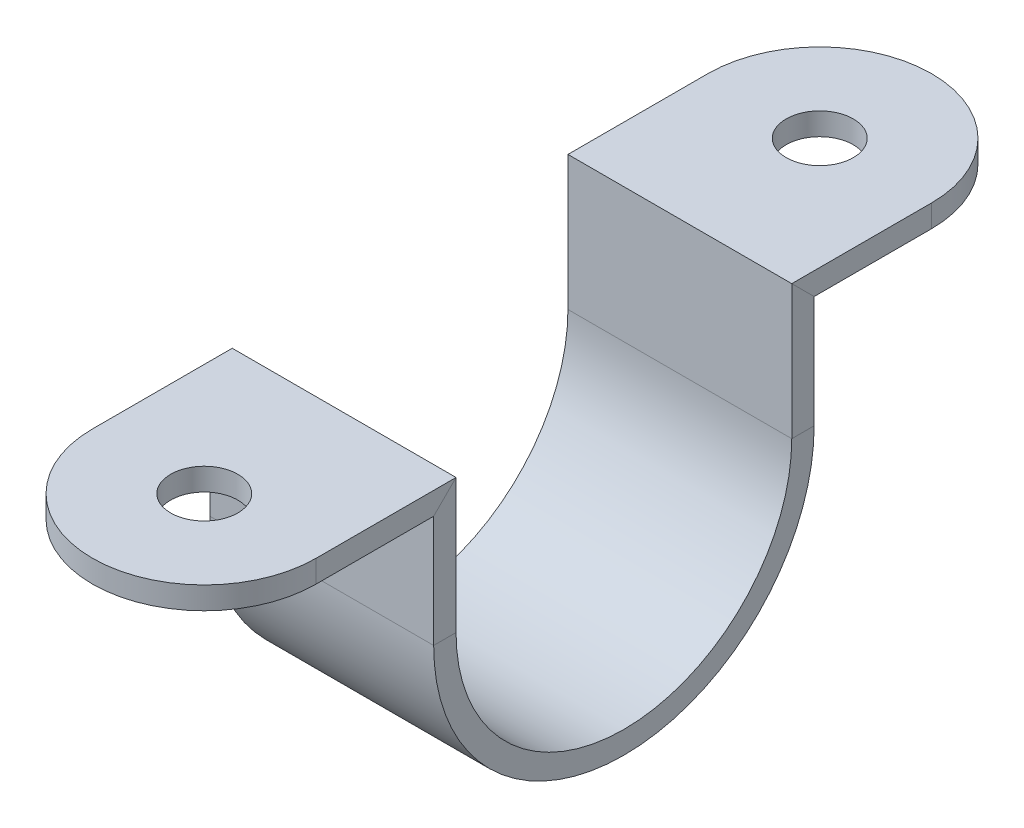
ISO-10303-21;
HEADER;
FILE_DESCRIPTION(('STEP AP214'),'2;1');
FILE_NAME('part.step','',(''),(''),'','','');
FILE_SCHEMA(('AUTOMOTIVE_DESIGN { 1 0 10303 214 1 1 1 1 }'));
ENDSEC;
DATA;
#1=APPLICATION_CONTEXT('core data for automotive mechanical design processes');
#2=APPLICATION_PROTOCOL_DEFINITION('international standard','automotive_design',2000,#1);
#3=PRODUCT_CONTEXT('',#1,'mechanical');
#4=PRODUCT('Part','Part','',(#3));
#5=PRODUCT_RELATED_PRODUCT_CATEGORY('part','',(#4));
#6=PRODUCT_DEFINITION_FORMATION('','',#4);
#7=PRODUCT_DEFINITION_CONTEXT('part definition',#1,'design');
#8=PRODUCT_DEFINITION('design','',#6,#7);
#9=PRODUCT_DEFINITION_SHAPE('','',#8);
#10=(LENGTH_UNIT() NAMED_UNIT(*) SI_UNIT(.MILLI.,.METRE.));
#11=(NAMED_UNIT(*) PLANE_ANGLE_UNIT() SI_UNIT($,.RADIAN.));
#12=(NAMED_UNIT(*) SI_UNIT($,.STERADIAN.) SOLID_ANGLE_UNIT());
#13=UNCERTAINTY_MEASURE_WITH_UNIT(LENGTH_MEASURE(1.E-05),#10,'distance_accuracy_value','');
#14=(GEOMETRIC_REPRESENTATION_CONTEXT(3) GLOBAL_UNCERTAINTY_ASSIGNED_CONTEXT((#13)) GLOBAL_UNIT_ASSIGNED_CONTEXT((#10,
#11,#12)) REPRESENTATION_CONTEXT('',''));
#15=CARTESIAN_POINT('',(0.,0.,0.));
#16=DIRECTION('',(0.,0.,1.));
#17=DIRECTION('',(1.,0.,0.));
#18=AXIS2_PLACEMENT_3D('',#15,#16,#17);
#19=CARTESIAN_POINT('',(0.,0.,-32.5));
#20=DIRECTION('',(0.,-1.,0.));
#21=DIRECTION('',(0.,0.,-1.));
#22=AXIS2_PLACEMENT_3D('',#19,#20,#21);
#23=CYLINDRICAL_SURFACE('',#22,5.);
#24=DIRECTION('',(0.,-1.,0.));
#25=VECTOR('',#24,1.);
#26=CARTESIAN_POINT('',(-5.,0.,-32.5));
#27=LINE('',#26,#25);
#28=CARTESIAN_POINT('',(-5.,0.,-32.5));
#29=VERTEX_POINT('',#28);
#30=CARTESIAN_POINT('',(-5.,-1.,-32.5));
#31=VERTEX_POINT('',#30);
#32=EDGE_CURVE('E254',#29,#31,#27,.T.);
#33=ORIENTED_EDGE('',*,*,#32,.F.);
#34=CARTESIAN_POINT('',(0.,0.,-32.5));
#35=DIRECTION('',(0.,-1.,0.));
#36=DIRECTION('',(0.,0.,-1.));
#37=AXIS2_PLACEMENT_3D('',#34,#35,#36);
#38=CIRCLE('',#37,5.);
#39=CARTESIAN_POINT('',(5.,0.,-32.5));
#40=VERTEX_POINT('',#39);
#41=EDGE_CURVE('E45',#40,#29,#38,.F.);
#42=ORIENTED_EDGE('',*,*,#41,.F.);
#43=DIRECTION('',(0.,-1.,0.));
#44=VECTOR('',#43,1.);
#45=CARTESIAN_POINT('',(5.,0.,-32.5));
#46=LINE('',#45,#44);
#47=CARTESIAN_POINT('',(5.,-1.,-32.5));
#48=VERTEX_POINT('',#47);
#49=EDGE_CURVE('E257',#48,#40,#46,.F.);
#50=ORIENTED_EDGE('',*,*,#49,.F.);
#51=CARTESIAN_POINT('',(0.,-1.,-32.5));
#52=DIRECTION('',(0.,1.,0.));
#53=DIRECTION('',(0.,0.,1.));
#54=AXIS2_PLACEMENT_3D('',#51,#52,#53);
#55=CIRCLE('',#54,5.);
#56=EDGE_CURVE('E11',#31,#48,#55,.F.);
#57=ORIENTED_EDGE('',*,*,#56,.F.);
#58=EDGE_LOOP('',(#33,#42,#50,#57));
#59=FACE_BOUND('',#58,.T.);
#60=ADVANCED_FACE('F36',(#59),#23,.T.);
#61=CARTESIAN_POINT('',(0.,0.,-5.));
#62=DIRECTION('',(0.,1.,0.));
#63=DIRECTION('',(0.,0.,1.));
#64=AXIS2_PLACEMENT_3D('',#61,#62,#63);
#65=CYLINDRICAL_SURFACE('',#64,5.);
#66=DIRECTION('',(0.,-1.,0.));
#67=VECTOR('',#66,1.);
#68=CARTESIAN_POINT('',(5.,0.,-5.));
#69=LINE('',#68,#67);
#70=CARTESIAN_POINT('',(5.,0.,-5.));
#71=VERTEX_POINT('',#70);
#72=CARTESIAN_POINT('',(5.,-1.,-5.));
#73=VERTEX_POINT('',#72);
#74=EDGE_CURVE('E170',#71,#73,#69,.T.);
#75=ORIENTED_EDGE('',*,*,#74,.F.);
#76=CARTESIAN_POINT('',(0.,0.,-5.));
#77=DIRECTION('',(0.,-1.,0.));
#78=DIRECTION('',(0.,0.,-1.));
#79=AXIS2_PLACEMENT_3D('',#76,#77,#78);
#80=CIRCLE('',#79,5.);
#81=CARTESIAN_POINT('',(-5.,0.,-5.));
#82=VERTEX_POINT('',#81);
#83=EDGE_CURVE('E132',#82,#71,#80,.F.);
#84=ORIENTED_EDGE('',*,*,#83,.F.);
#85=DIRECTION('',(0.,-1.,0.));
#86=VECTOR('',#85,1.);
#87=CARTESIAN_POINT('',(-5.,0.,-5.));
#88=LINE('',#87,#86);
#89=CARTESIAN_POINT('',(-5.,-1.,-5.));
#90=VERTEX_POINT('',#89);
#91=EDGE_CURVE('E248',#90,#82,#88,.F.);
#92=ORIENTED_EDGE('',*,*,#91,.F.);
#93=CARTESIAN_POINT('',(0.,-1.,-5.));
#94=DIRECTION('',(0.,1.,0.));
#95=DIRECTION('',(0.,0.,1.));
#96=AXIS2_PLACEMENT_3D('',#93,#94,#95);
#97=CIRCLE('',#96,5.);
#98=EDGE_CURVE('E252',#73,#90,#97,.F.);
#99=ORIENTED_EDGE('',*,*,#98,.F.);
#100=EDGE_LOOP('',(#75,#84,#92,#99));
#101=FACE_BOUND('',#100,.T.);
#102=ADVANCED_FACE('F287',(#101),#65,.T.);
#103=CARTESIAN_POINT('',(-5.,0.,-26.25));
#104=DIRECTION('',(1.,0.,0.));
#105=DIRECTION('',(0.,0.,-1.));
#106=AXIS2_PLACEMENT_3D('',#103,#104,#105);
#107=PLANE('',#106);
#108=DIRECTION('',(0.,0.,-1.));
#109=VECTOR('',#108,1.);
#110=CARTESIAN_POINT('',(-5.,0.,-26.25));
#111=LINE('',#110,#109);
#112=CARTESIAN_POINT('',(-5.,0.,-26.25));
#113=VERTEX_POINT('',#112);
#114=EDGE_CURVE('E228',#113,#29,#111,.T.);
#115=ORIENTED_EDGE('',*,*,#114,.T.);
#116=ORIENTED_EDGE('',*,*,#32,.T.);
#117=DIRECTION('',(0.,0.,-1.));
#118=VECTOR('',#117,1.);
#119=CARTESIAN_POINT('',(-5.,-1.,-26.25));
#120=LINE('',#119,#118);
#121=CARTESIAN_POINT('',(-5.,-1.,-27.25));
#122=VERTEX_POINT('',#121);
#123=EDGE_CURVE('E243',#122,#31,#120,.T.);
#124=ORIENTED_EDGE('',*,*,#123,.F.);
#125=DIRECTION('',(0.,0.707106781186548,0.707106781186548));
#126=VECTOR('',#125,1.);
#127=CARTESIAN_POINT('',(-5.,-3.,-29.25));
#128=LINE('',#127,#126);
#129=EDGE_CURVE('E186',#122,#113,#128,.T.);
#130=ORIENTED_EDGE('',*,*,#129,.T.);
#131=EDGE_LOOP('',(#115,#116,#124,#130));
#132=FACE_BOUND('',#131,.T.);
#133=ADVANCED_FACE('F285',(#132),#107,.F.);
#134=CARTESIAN_POINT('',(-5.,-1.,-26.25));
#135=DIRECTION('',(0.,1.,0.));
#136=DIRECTION('',(0.,0.,1.));
#137=AXIS2_PLACEMENT_3D('',#134,#135,#136);
#138=PLANE('',#137);
#139=CARTESIAN_POINT('',(0.,-1.,-32.5));
#140=DIRECTION('',(0.,1.,0.));
#141=DIRECTION('',(0.,0.,1.));
#142=AXIS2_PLACEMENT_3D('',#139,#140,#141);
#143=CIRCLE('',#142,1.5);
#144=CARTESIAN_POINT('',(0.,-1.,-31.));
#145=VERTEX_POINT('',#144);
#146=EDGE_CURVE('E166',#145,#145,#143,.T.);
#147=ORIENTED_EDGE('',*,*,#146,.T.);
#148=EDGE_LOOP('',(#147));
#149=FACE_BOUND('',#148,.T.);
#150=ORIENTED_EDGE('',*,*,#123,.T.);
#151=ORIENTED_EDGE('',*,*,#56,.T.);
#152=DIRECTION('',(0.,0.,-1.));
#153=VECTOR('',#152,1.);
#154=CARTESIAN_POINT('',(5.,-1.,-26.25));
#155=LINE('',#154,#153);
#156=CARTESIAN_POINT('',(5.,-1.,-27.25));
#157=VERTEX_POINT('',#156);
#158=EDGE_CURVE('E240',#157,#48,#155,.T.);
#159=ORIENTED_EDGE('',*,*,#158,.F.);
#160=DIRECTION('',(-1.,0.,0.));
#161=VECTOR('',#160,1.);
#162=CARTESIAN_POINT('',(-5.,-1.,-27.25));
#163=LINE('',#162,#161);
#164=EDGE_CURVE('E227',#157,#122,#163,.T.);
#165=ORIENTED_EDGE('',*,*,#164,.T.);
#166=EDGE_LOOP('',(#150,#151,#159,#165));
#167=FACE_BOUND('',#166,.T.);
#168=ADVANCED_FACE('F273',(#149,#167),#138,.F.);
#169=CARTESIAN_POINT('',(5.,0.,-26.25));
#170=DIRECTION('',(-1.,0.,0.));
#171=DIRECTION('',(0.,0.,1.));
#172=AXIS2_PLACEMENT_3D('',#169,#170,#171);
#173=PLANE('',#172);
#174=ORIENTED_EDGE('',*,*,#158,.T.);
#175=ORIENTED_EDGE('',*,*,#49,.T.);
#176=DIRECTION('',(0.,0.,-1.));
#177=VECTOR('',#176,1.);
#178=CARTESIAN_POINT('',(5.,0.,-26.25));
#179=LINE('',#178,#177);
#180=CARTESIAN_POINT('',(5.,0.,-26.25));
#181=VERTEX_POINT('',#180);
#182=EDGE_CURVE('E237',#181,#40,#179,.T.);
#183=ORIENTED_EDGE('',*,*,#182,.F.);
#184=DIRECTION('',(0.,-0.707106781186548,-0.707106781186548));
#185=VECTOR('',#184,1.);
#186=CARTESIAN_POINT('',(5.,-3.,-29.25));
#187=LINE('',#186,#185);
#188=EDGE_CURVE('E224',#181,#157,#187,.T.);
#189=ORIENTED_EDGE('',*,*,#188,.T.);
#190=EDGE_LOOP('',(#174,#175,#183,#189));
#191=FACE_BOUND('',#190,.T.);
#192=ADVANCED_FACE('F300',(#191),#173,.F.);
#193=CARTESIAN_POINT('',(-5.,0.,-26.25));
#194=DIRECTION('',(0.,-1.,0.));
#195=DIRECTION('',(0.,0.,-1.));
#196=AXIS2_PLACEMENT_3D('',#193,#194,#195);
#197=PLANE('',#196);
#198=CARTESIAN_POINT('',(0.,0.,-32.5));
#199=DIRECTION('',(0.,-1.,0.));
#200=DIRECTION('',(0.,0.,-1.));
#201=AXIS2_PLACEMENT_3D('',#198,#199,#200);
#202=CIRCLE('',#201,1.5);
#203=CARTESIAN_POINT('',(0.,0.,-31.));
#204=VERTEX_POINT('',#203);
#205=EDGE_CURVE('E40',#204,#204,#202,.T.);
#206=ORIENTED_EDGE('',*,*,#205,.T.);
#207=EDGE_LOOP('',(#206));
#208=FACE_BOUND('',#207,.T.);
#209=ORIENTED_EDGE('',*,*,#182,.T.);
#210=ORIENTED_EDGE('',*,*,#41,.T.);
#211=ORIENTED_EDGE('',*,*,#114,.F.);
#212=DIRECTION('',(-1.,0.,0.));
#213=VECTOR('',#212,1.);
#214=CARTESIAN_POINT('',(-5.,0.,-26.25));
#215=LINE('',#214,#213);
#216=EDGE_CURVE('E146',#181,#113,#215,.T.);
#217=ORIENTED_EDGE('',*,*,#216,.F.);
#218=EDGE_LOOP('',(#209,#210,#211,#217));
#219=FACE_BOUND('',#218,.T.);
#220=ADVANCED_FACE('F297',(#208,#219),#197,.F.);
#221=CARTESIAN_POINT('',(-5.,0.,-11.25));
#222=DIRECTION('',(1.,0.,0.));
#223=DIRECTION('',(0.,0.,-1.));
#224=AXIS2_PLACEMENT_3D('',#221,#222,#223);
#225=PLANE('',#224);
#226=DIRECTION('',(0.,0.707106781186548,-0.707106781186548));
#227=VECTOR('',#226,1.);
#228=CARTESIAN_POINT('',(-5.,-5.625,-5.625));
#229=LINE('',#228,#227);
#230=CARTESIAN_POINT('',(-5.,-0.999999999999998,-10.25));
#231=VERTEX_POINT('',#230);
#232=CARTESIAN_POINT('',(-5.,0.,-11.25));
#233=VERTEX_POINT('',#232);
#234=EDGE_CURVE('E162',#231,#233,#229,.T.);
#235=ORIENTED_EDGE('',*,*,#234,.T.);
#236=DIRECTION('',(0.,-1.,0.));
#237=VECTOR('',#236,1.);
#238=CARTESIAN_POINT('',(-5.,0.,-11.25));
#239=LINE('',#238,#237);
#240=CARTESIAN_POINT('',(-5.,-6.,-11.25));
#241=VERTEX_POINT('',#240);
#242=EDGE_CURVE('E160',#233,#241,#239,.T.);
#243=ORIENTED_EDGE('',*,*,#242,.T.);
#244=DIRECTION('',(0.,0.,1.));
#245=VECTOR('',#244,1.);
#246=CARTESIAN_POINT('',(-5.,-6.,-11.25));
#247=LINE('',#246,#245);
#248=CARTESIAN_POINT('',(-5.,-6.,-10.25));
#249=VERTEX_POINT('',#248);
#250=EDGE_CURVE('E180',#241,#249,#247,.T.);
#251=ORIENTED_EDGE('',*,*,#250,.T.);
#252=DIRECTION('',(0.,-1.,0.));
#253=VECTOR('',#252,1.);
#254=CARTESIAN_POINT('',(-5.,0.,-10.25));
#255=LINE('',#254,#253);
#256=EDGE_CURVE('E177',#231,#249,#255,.T.);
#257=ORIENTED_EDGE('',*,*,#256,.F.);
#258=EDGE_LOOP('',(#235,#243,#251,#257));
#259=FACE_BOUND('',#258,.T.);
#260=ADVANCED_FACE('F332',(#259),#225,.F.);
#261=CARTESIAN_POINT('',(-5.,0.,-10.25));
#262=DIRECTION('',(0.,0.,-1.));
#263=DIRECTION('',(-1.,0.,0.));
#264=AXIS2_PLACEMENT_3D('',#261,#262,#263);
#265=PLANE('',#264);
#266=DIRECTION('',(-1.,0.,0.));
#267=VECTOR('',#266,1.);
#268=CARTESIAN_POINT('',(-5.,-1.,-10.25));
#269=LINE('',#268,#267);
#270=CARTESIAN_POINT('',(5.,-1.,-10.25));
#271=VERTEX_POINT('',#270);
#272=EDGE_CURVE('E145',#271,#231,#269,.T.);
#273=ORIENTED_EDGE('',*,*,#272,.T.);
#274=ORIENTED_EDGE('',*,*,#256,.T.);
#275=DIRECTION('',(1.,0.,0.));
#276=VECTOR('',#275,1.);
#277=CARTESIAN_POINT('',(-5.,-6.,-10.25));
#278=LINE('',#277,#276);
#279=CARTESIAN_POINT('',(5.,-6.,-10.25));
#280=VERTEX_POINT('',#279);
#281=EDGE_CURVE('E179',#249,#280,#278,.T.);
#282=ORIENTED_EDGE('',*,*,#281,.T.);
#283=DIRECTION('',(0.,-1.,0.));
#284=VECTOR('',#283,1.);
#285=CARTESIAN_POINT('',(5.,0.,-10.25));
#286=LINE('',#285,#284);
#287=EDGE_CURVE('E181',#271,#280,#286,.T.);
#288=ORIENTED_EDGE('',*,*,#287,.F.);
#289=EDGE_LOOP('',(#273,#274,#282,#288));
#290=FACE_BOUND('',#289,.T.);
#291=ADVANCED_FACE('F359',(#290),#265,.F.);
#292=CARTESIAN_POINT('',(5.,0.,-11.25));
#293=DIRECTION('',(-1.,0.,0.));
#294=DIRECTION('',(0.,0.,1.));
#295=AXIS2_PLACEMENT_3D('',#292,#293,#294);
#296=PLANE('',#295);
#297=DIRECTION('',(0.,-0.707106781186548,0.707106781186548));
#298=VECTOR('',#297,1.);
#299=CARTESIAN_POINT('',(5.,-5.625,-5.625));
#300=LINE('',#299,#298);
#301=CARTESIAN_POINT('',(5.,0.,-11.25));
#302=VERTEX_POINT('',#301);
#303=EDGE_CURVE('E139',#302,#271,#300,.T.);
#304=ORIENTED_EDGE('',*,*,#303,.T.);
#305=ORIENTED_EDGE('',*,*,#287,.T.);
#306=DIRECTION('',(0.,0.,-1.));
#307=VECTOR('',#306,1.);
#308=CARTESIAN_POINT('',(5.,-6.,-11.25));
#309=LINE('',#308,#307);
#310=CARTESIAN_POINT('',(5.,-6.,-11.25));
#311=VERTEX_POINT('',#310);
#312=EDGE_CURVE('E153',#280,#311,#309,.T.);
#313=ORIENTED_EDGE('',*,*,#312,.T.);
#314=DIRECTION('',(0.,-1.,0.));
#315=VECTOR('',#314,1.);
#316=CARTESIAN_POINT('',(5.,0.,-11.25));
#317=LINE('',#316,#315);
#318=EDGE_CURVE('E150',#302,#311,#317,.T.);
#319=ORIENTED_EDGE('',*,*,#318,.F.);
#320=EDGE_LOOP('',(#304,#305,#313,#319));
#321=FACE_BOUND('',#320,.T.);
#322=ADVANCED_FACE('F151',(#321),#296,.F.);
#323=CARTESIAN_POINT('',(-5.,0.,-11.25));
#324=DIRECTION('',(0.,0.,1.));
#325=DIRECTION('',(1.,0.,0.));
#326=AXIS2_PLACEMENT_3D('',#323,#324,#325);
#327=PLANE('',#326);
#328=DIRECTION('',(-1.,0.,0.));
#329=VECTOR('',#328,1.);
#330=CARTESIAN_POINT('',(-5.,-6.,-11.25));
#331=LINE('',#330,#329);
#332=EDGE_CURVE('E156',#311,#241,#331,.T.);
#333=ORIENTED_EDGE('',*,*,#332,.T.);
#334=ORIENTED_EDGE('',*,*,#242,.F.);
#335=DIRECTION('',(-1.,0.,0.));
#336=VECTOR('',#335,1.);
#337=CARTESIAN_POINT('',(-5.,0.,-11.25));
#338=LINE('',#337,#336);
#339=EDGE_CURVE('E130',#302,#233,#338,.T.);
#340=ORIENTED_EDGE('',*,*,#339,.F.);
#341=ORIENTED_EDGE('',*,*,#318,.T.);
#342=EDGE_LOOP('',(#333,#334,#340,#341));
#343=FACE_BOUND('',#342,.T.);
#344=ADVANCED_FACE('F158',(#343),#327,.F.);
#345=CARTESIAN_POINT('',(-5.,-6.,-11.25));
#346=DIRECTION('',(1.,0.,0.));
#347=DIRECTION('',(0.,0.,-1.));
#348=AXIS2_PLACEMENT_3D('',#345,#346,#347);
#349=PLANE('',#348);
#350=CARTESIAN_POINT('',(-5.,-6.,-18.75));
#351=DIRECTION('',(1.,0.,0.));
#352=DIRECTION('',(0.,0.,1.));
#353=AXIS2_PLACEMENT_3D('',#350,#351,#352);
#354=CIRCLE('',#353,8.5);
#355=CARTESIAN_POINT('',(-5.,-6.00000000000001,-27.25));
#356=VERTEX_POINT('',#355);
#357=EDGE_CURVE('E190',#249,#356,#354,.T.);
#358=ORIENTED_EDGE('',*,*,#357,.F.);
#359=ORIENTED_EDGE('',*,*,#250,.F.);
#360=CARTESIAN_POINT('',(-5.,-6.,-18.75));
#361=DIRECTION('',(1.,0.,0.));
#362=DIRECTION('',(0.,0.,1.));
#363=AXIS2_PLACEMENT_3D('',#360,#361,#362);
#364=CIRCLE('',#363,7.5);
#365=CARTESIAN_POINT('',(-5.,-6.00000000000001,-26.25));
#366=VERTEX_POINT('',#365);
#367=EDGE_CURVE('E191',#241,#366,#364,.T.);
#368=ORIENTED_EDGE('',*,*,#367,.T.);
#369=DIRECTION('',(0.,0.,-1.));
#370=VECTOR('',#369,1.);
#371=CARTESIAN_POINT('',(-5.,-6.,-26.25));
#372=LINE('',#371,#370);
#373=EDGE_CURVE('E187',#366,#356,#372,.T.);
#374=ORIENTED_EDGE('',*,*,#373,.T.);
#375=EDGE_LOOP('',(#358,#359,#368,#374));
#376=FACE_BOUND('',#375,.T.);
#377=ADVANCED_FACE('F380',(#376),#349,.F.);
#378=CARTESIAN_POINT('',(0.,-6.,-18.75));
#379=DIRECTION('',(1.,0.,0.));
#380=DIRECTION('',(0.,0.,-1.));
#381=AXIS2_PLACEMENT_3D('',#378,#379,#380);
#382=CYLINDRICAL_SURFACE('',#381,8.5);
#383=CARTESIAN_POINT('',(5.,-6.,-18.75));
#384=DIRECTION('',(1.,0.,0.));
#385=DIRECTION('',(0.,0.,1.));
#386=AXIS2_PLACEMENT_3D('',#383,#384,#385);
#387=CIRCLE('',#386,8.5);
#388=CARTESIAN_POINT('',(5.,-6.00000000000001,-27.25));
#389=VERTEX_POINT('',#388);
#390=EDGE_CURVE('E206',#280,#389,#387,.T.);
#391=ORIENTED_EDGE('',*,*,#390,.F.);
#392=ORIENTED_EDGE('',*,*,#281,.F.);
#393=ORIENTED_EDGE('',*,*,#357,.T.);
#394=DIRECTION('',(1.,0.,0.));
#395=VECTOR('',#394,1.);
#396=CARTESIAN_POINT('',(-5.,-6.,-27.25));
#397=LINE('',#396,#395);
#398=EDGE_CURVE('E194',#356,#389,#397,.T.);
#399=ORIENTED_EDGE('',*,*,#398,.T.);
#400=EDGE_LOOP('',(#391,#392,#393,#399));
#401=FACE_BOUND('',#400,.T.);
#402=ADVANCED_FACE('F387',(#401),#382,.T.);
#403=CARTESIAN_POINT('',(5.,-6.,-11.25));
#404=DIRECTION('',(-1.,0.,0.));
#405=DIRECTION('',(0.,0.,1.));
#406=AXIS2_PLACEMENT_3D('',#403,#404,#405);
#407=PLANE('',#406);
#408=CARTESIAN_POINT('',(5.,-6.,-18.75));
#409=DIRECTION('',(1.,0.,0.));
#410=DIRECTION('',(0.,0.,1.));
#411=AXIS2_PLACEMENT_3D('',#408,#409,#410);
#412=CIRCLE('',#411,7.5);
#413=CARTESIAN_POINT('',(5.,-6.00000000000001,-26.25));
#414=VERTEX_POINT('',#413);
#415=EDGE_CURVE('E213',#311,#414,#412,.T.);
#416=ORIENTED_EDGE('',*,*,#415,.F.);
#417=ORIENTED_EDGE('',*,*,#312,.F.);
#418=ORIENTED_EDGE('',*,*,#390,.T.);
#419=DIRECTION('',(0.,0.,1.));
#420=VECTOR('',#419,1.);
#421=CARTESIAN_POINT('',(5.,-6.,-26.25));
#422=LINE('',#421,#420);
#423=EDGE_CURVE('E209',#389,#414,#422,.T.);
#424=ORIENTED_EDGE('',*,*,#423,.T.);
#425=EDGE_LOOP('',(#416,#417,#418,#424));
#426=FACE_BOUND('',#425,.T.);
#427=ADVANCED_FACE('F315',(#426),#407,.F.);
#428=CARTESIAN_POINT('',(0.,-6.,-18.75));
#429=DIRECTION('',(1.,0.,0.));
#430=DIRECTION('',(0.,0.,-1.));
#431=AXIS2_PLACEMENT_3D('',#428,#429,#430);
#432=CYLINDRICAL_SURFACE('',#431,7.5);
#433=DIRECTION('',(-1.,0.,0.));
#434=VECTOR('',#433,1.);
#435=CARTESIAN_POINT('',(-5.,-6.,-26.25));
#436=LINE('',#435,#434);
#437=EDGE_CURVE('E201',#414,#366,#436,.T.);
#438=ORIENTED_EDGE('',*,*,#437,.T.);
#439=ORIENTED_EDGE('',*,*,#367,.F.);
#440=ORIENTED_EDGE('',*,*,#332,.F.);
#441=ORIENTED_EDGE('',*,*,#415,.T.);
#442=EDGE_LOOP('',(#438,#439,#440,#441));
#443=FACE_BOUND('',#442,.T.);
#444=ADVANCED_FACE('F311',(#443),#432,.F.);
#445=CARTESIAN_POINT('',(-5.,-6.,-26.25));
#446=DIRECTION('',(0.,0.,-1.));
#447=DIRECTION('',(-1.,0.,0.));
#448=AXIS2_PLACEMENT_3D('',#445,#446,#447);
#449=PLANE('',#448);
#450=ORIENTED_EDGE('',*,*,#216,.T.);
#451=DIRECTION('',(0.,1.,0.));
#452=VECTOR('',#451,1.);
#453=CARTESIAN_POINT('',(-5.,-6.,-26.25));
#454=LINE('',#453,#452);
#455=EDGE_CURVE('E197',#366,#113,#454,.T.);
#456=ORIENTED_EDGE('',*,*,#455,.F.);
#457=ORIENTED_EDGE('',*,*,#437,.F.);
#458=DIRECTION('',(0.,1.,0.));
#459=VECTOR('',#458,1.);
#460=CARTESIAN_POINT('',(5.,-6.,-26.25));
#461=LINE('',#460,#459);
#462=EDGE_CURVE('E216',#414,#181,#461,.T.);
#463=ORIENTED_EDGE('',*,*,#462,.T.);
#464=EDGE_LOOP('',(#450,#456,#457,#463));
#465=FACE_BOUND('',#464,.T.);
#466=ADVANCED_FACE('F309',(#465),#449,.F.);
#467=CARTESIAN_POINT('',(-5.,-6.,-26.25));
#468=DIRECTION('',(1.,0.,0.));
#469=DIRECTION('',(0.,0.,-1.));
#470=AXIS2_PLACEMENT_3D('',#467,#468,#469);
#471=PLANE('',#470);
#472=DIRECTION('',(0.,1.,0.));
#473=VECTOR('',#472,1.);
#474=CARTESIAN_POINT('',(-5.,-6.,-27.25));
#475=LINE('',#474,#473);
#476=EDGE_CURVE('E200',#356,#122,#475,.T.);
#477=ORIENTED_EDGE('',*,*,#476,.F.);
#478=ORIENTED_EDGE('',*,*,#373,.F.);
#479=ORIENTED_EDGE('',*,*,#455,.T.);
#480=ORIENTED_EDGE('',*,*,#129,.F.);
#481=EDGE_LOOP('',(#477,#478,#479,#480));
#482=FACE_BOUND('',#481,.T.);
#483=ADVANCED_FACE('F306',(#482),#471,.F.);
#484=CARTESIAN_POINT('',(-5.,-6.,-27.25));
#485=DIRECTION('',(0.,0.,1.));
#486=DIRECTION('',(1.,0.,0.));
#487=AXIS2_PLACEMENT_3D('',#484,#485,#486);
#488=PLANE('',#487);
#489=DIRECTION('',(0.,1.,0.));
#490=VECTOR('',#489,1.);
#491=CARTESIAN_POINT('',(5.,-6.,-27.25));
#492=LINE('',#491,#490);
#493=EDGE_CURVE('E219',#389,#157,#492,.T.);
#494=ORIENTED_EDGE('',*,*,#493,.F.);
#495=ORIENTED_EDGE('',*,*,#398,.F.);
#496=ORIENTED_EDGE('',*,*,#476,.T.);
#497=ORIENTED_EDGE('',*,*,#164,.F.);
#498=EDGE_LOOP('',(#494,#495,#496,#497));
#499=FACE_BOUND('',#498,.T.);
#500=ADVANCED_FACE('F303',(#499),#488,.F.);
#501=CARTESIAN_POINT('',(5.,-6.,-26.25));
#502=DIRECTION('',(-1.,0.,0.));
#503=DIRECTION('',(0.,0.,1.));
#504=AXIS2_PLACEMENT_3D('',#501,#502,#503);
#505=PLANE('',#504);
#506=ORIENTED_EDGE('',*,*,#462,.F.);
#507=ORIENTED_EDGE('',*,*,#423,.F.);
#508=ORIENTED_EDGE('',*,*,#493,.T.);
#509=ORIENTED_EDGE('',*,*,#188,.F.);
#510=EDGE_LOOP('',(#506,#507,#508,#509));
#511=FACE_BOUND('',#510,.T.);
#512=ADVANCED_FACE('F318',(#511),#505,.F.);
#513=CARTESIAN_POINT('',(-5.,0.,0.));
#514=DIRECTION('',(0.,-1.,0.));
#515=DIRECTION('',(0.,0.,-1.));
#516=AXIS2_PLACEMENT_3D('',#513,#514,#515);
#517=PLANE('',#516);
#518=CARTESIAN_POINT('',(0.,0.,-5.));
#519=DIRECTION('',(0.,-1.,0.));
#520=DIRECTION('',(0.,0.,-1.));
#521=AXIS2_PLACEMENT_3D('',#518,#519,#520);
#522=CIRCLE('',#521,1.5);
#523=CARTESIAN_POINT('',(0.,0.,-3.5));
#524=VERTEX_POINT('',#523);
#525=EDGE_CURVE('E261',#524,#524,#522,.T.);
#526=ORIENTED_EDGE('',*,*,#525,.T.);
#527=EDGE_LOOP('',(#526));
#528=FACE_BOUND('',#527,.T.);
#529=DIRECTION('',(0.,0.,-1.));
#530=VECTOR('',#529,1.);
#531=CARTESIAN_POINT('',(-5.,0.,0.));
#532=LINE('',#531,#530);
#533=EDGE_CURVE('E169',#82,#233,#532,.T.);
#534=ORIENTED_EDGE('',*,*,#533,.F.);
#535=ORIENTED_EDGE('',*,*,#83,.T.);
#536=DIRECTION('',(0.,0.,-1.));
#537=VECTOR('',#536,1.);
#538=CARTESIAN_POINT('',(5.,0.,0.));
#539=LINE('',#538,#537);
#540=EDGE_CURVE('E125',#71,#302,#539,.T.);
#541=ORIENTED_EDGE('',*,*,#540,.T.);
#542=ORIENTED_EDGE('',*,*,#339,.T.);
#543=EDGE_LOOP('',(#534,#535,#541,#542));
#544=FACE_BOUND('',#543,.T.);
#545=ADVANCED_FACE('F128',(#528,#544),#517,.F.);
#546=CARTESIAN_POINT('',(-5.,0.,0.));
#547=DIRECTION('',(1.,0.,0.));
#548=DIRECTION('',(0.,0.,-1.));
#549=AXIS2_PLACEMENT_3D('',#546,#547,#548);
#550=PLANE('',#549);
#551=DIRECTION('',(0.,0.,-1.));
#552=VECTOR('',#551,1.);
#553=CARTESIAN_POINT('',(-5.,-1.,0.));
#554=LINE('',#553,#552);
#555=EDGE_CURVE('E171',#90,#231,#554,.T.);
#556=ORIENTED_EDGE('',*,*,#555,.F.);
#557=ORIENTED_EDGE('',*,*,#91,.T.);
#558=ORIENTED_EDGE('',*,*,#533,.T.);
#559=ORIENTED_EDGE('',*,*,#234,.F.);
#560=EDGE_LOOP('',(#556,#557,#558,#559));
#561=FACE_BOUND('',#560,.T.);
#562=ADVANCED_FACE('F325',(#561),#550,.F.);
#563=CARTESIAN_POINT('',(-5.,-1.,0.));
#564=DIRECTION('',(0.,1.,0.));
#565=DIRECTION('',(0.,0.,1.));
#566=AXIS2_PLACEMENT_3D('',#563,#564,#565);
#567=PLANE('',#566);
#568=CARTESIAN_POINT('',(0.,-0.999999999999999,-5.));
#569=DIRECTION('',(0.,1.,0.));
#570=DIRECTION('',(0.,0.,1.));
#571=AXIS2_PLACEMENT_3D('',#568,#569,#570);
#572=CIRCLE('',#571,1.5);
#573=CARTESIAN_POINT('',(0.,-1.,-3.5));
#574=VERTEX_POINT('',#573);
#575=EDGE_CURVE('E259',#574,#574,#572,.T.);
#576=ORIENTED_EDGE('',*,*,#575,.T.);
#577=EDGE_LOOP('',(#576));
#578=FACE_BOUND('',#577,.T.);
#579=DIRECTION('',(0.,0.,-1.));
#580=VECTOR('',#579,1.);
#581=CARTESIAN_POINT('',(5.,-1.,0.));
#582=LINE('',#581,#580);
#583=EDGE_CURVE('E136',#73,#271,#582,.T.);
#584=ORIENTED_EDGE('',*,*,#583,.F.);
#585=ORIENTED_EDGE('',*,*,#98,.T.);
#586=ORIENTED_EDGE('',*,*,#555,.T.);
#587=ORIENTED_EDGE('',*,*,#272,.F.);
#588=EDGE_LOOP('',(#584,#585,#586,#587));
#589=FACE_BOUND('',#588,.T.);
#590=ADVANCED_FACE('F445',(#578,#589),#567,.F.);
#591=CARTESIAN_POINT('',(5.,0.,0.));
#592=DIRECTION('',(-1.,0.,0.));
#593=DIRECTION('',(0.,0.,1.));
#594=AXIS2_PLACEMENT_3D('',#591,#592,#593);
#595=PLANE('',#594);
#596=ORIENTED_EDGE('',*,*,#540,.F.);
#597=ORIENTED_EDGE('',*,*,#74,.T.);
#598=ORIENTED_EDGE('',*,*,#583,.T.);
#599=ORIENTED_EDGE('',*,*,#303,.F.);
#600=EDGE_LOOP('',(#596,#597,#598,#599));
#601=FACE_BOUND('',#600,.T.);
#602=ADVANCED_FACE('F141',(#601),#595,.F.);
#603=CARTESIAN_POINT('',(0.,-14.5,-5.));
#604=DIRECTION('',(0.,1.,0.));
#605=DIRECTION('',(0.,0.,1.));
#606=AXIS2_PLACEMENT_3D('',#603,#604,#605);
#607=CYLINDRICAL_SURFACE('',#606,1.5);
#608=CARTESIAN_POINT('',(0.,-1.,-3.5));
#609=CARTESIAN_POINT('',(0.,-0.989583333333334,-3.5));
#610=CARTESIAN_POINT('',(0.,-0.979166666666668,-3.5));
#611=CARTESIAN_POINT('',(0.,-0.958333333333334,-3.5));
#612=CARTESIAN_POINT('',(0.,-0.947916666666668,-3.5));
#613=CARTESIAN_POINT('',(0.,-0.927083333333334,-3.5));
#614=CARTESIAN_POINT('',(0.,-0.916666666666668,-3.5));
#615=CARTESIAN_POINT('',(0.,-0.895833333333334,-3.5));
#616=CARTESIAN_POINT('',(0.,-0.885416666666668,-3.5));
#617=CARTESIAN_POINT('',(0.,-0.864583333333334,-3.5));
#618=CARTESIAN_POINT('',(0.,-0.854166666666667,-3.5));
#619=CARTESIAN_POINT('',(0.,-0.833333333333334,-3.5));
#620=CARTESIAN_POINT('',(0.,-0.822916666666667,-3.5));
#621=CARTESIAN_POINT('',(0.,-0.802083333333334,-3.5));
#622=CARTESIAN_POINT('',(0.,-0.791666666666667,-3.5));
#623=CARTESIAN_POINT('',(0.,-0.770833333333334,-3.5));
#624=CARTESIAN_POINT('',(0.,-0.760416666666667,-3.5));
#625=CARTESIAN_POINT('',(0.,-0.739583333333334,-3.5));
#626=CARTESIAN_POINT('',(0.,-0.729166666666667,-3.5));
#627=CARTESIAN_POINT('',(0.,-0.708333333333334,-3.5));
#628=CARTESIAN_POINT('',(0.,-0.697916666666667,-3.5));
#629=CARTESIAN_POINT('',(0.,-0.677083333333334,-3.5));
#630=CARTESIAN_POINT('',(0.,-0.666666666666667,-3.5));
#631=CARTESIAN_POINT('',(0.,-0.645833333333334,-3.5));
#632=CARTESIAN_POINT('',(0.,-0.635416666666667,-3.5));
#633=CARTESIAN_POINT('',(0.,-0.614583333333334,-3.5));
#634=CARTESIAN_POINT('',(0.,-0.604166666666667,-3.5));
#635=CARTESIAN_POINT('',(0.,-0.583333333333334,-3.5));
#636=CARTESIAN_POINT('',(0.,-0.572916666666667,-3.5));
#637=CARTESIAN_POINT('',(0.,-0.552083333333334,-3.5));
#638=CARTESIAN_POINT('',(0.,-0.541666666666667,-3.5));
#639=CARTESIAN_POINT('',(0.,-0.520833333333334,-3.5));
#640=CARTESIAN_POINT('',(0.,-0.510416666666667,-3.5));
#641=CARTESIAN_POINT('',(0.,-0.489583333333334,-3.5));
#642=CARTESIAN_POINT('',(0.,-0.479166666666667,-3.5));
#643=CARTESIAN_POINT('',(0.,-0.458333333333334,-3.5));
#644=CARTESIAN_POINT('',(0.,-0.447916666666667,-3.5));
#645=CARTESIAN_POINT('',(0.,-0.427083333333334,-3.5));
#646=CARTESIAN_POINT('',(0.,-0.416666666666667,-3.5));
#647=CARTESIAN_POINT('',(0.,-0.395833333333334,-3.5));
#648=CARTESIAN_POINT('',(0.,-0.385416666666667,-3.5));
#649=CARTESIAN_POINT('',(0.,-0.364583333333334,-3.5));
#650=CARTESIAN_POINT('',(0.,-0.354166666666667,-3.5));
#651=CARTESIAN_POINT('',(0.,-0.333333333333334,-3.5));
#652=CARTESIAN_POINT('',(0.,-0.322916666666667,-3.5));
#653=CARTESIAN_POINT('',(0.,-0.302083333333334,-3.5));
#654=CARTESIAN_POINT('',(0.,-0.291666666666667,-3.5));
#655=CARTESIAN_POINT('',(0.,-0.270833333333334,-3.5));
#656=CARTESIAN_POINT('',(0.,-0.260416666666667,-3.5));
#657=CARTESIAN_POINT('',(0.,-0.239583333333334,-3.5));
#658=CARTESIAN_POINT('',(0.,-0.229166666666667,-3.5));
#659=CARTESIAN_POINT('',(0.,-0.208333333333334,-3.5));
#660=CARTESIAN_POINT('',(0.,-0.197916666666667,-3.5));
#661=CARTESIAN_POINT('',(0.,-0.177083333333333,-3.5));
#662=CARTESIAN_POINT('',(0.,-0.166666666666667,-3.5));
#663=CARTESIAN_POINT('',(0.,-0.145833333333333,-3.5));
#664=CARTESIAN_POINT('',(0.,-0.135416666666667,-3.5));
#665=CARTESIAN_POINT('',(0.,-0.114583333333333,-3.5));
#666=CARTESIAN_POINT('',(0.,-0.104166666666667,-3.5));
#667=CARTESIAN_POINT('',(0.,-0.0833333333333334,-3.5));
#668=CARTESIAN_POINT('',(0.,-0.0729166666666667,-3.5));
#669=CARTESIAN_POINT('',(0.,-0.0520833333333334,-3.5));
#670=CARTESIAN_POINT('',(0.,-0.0416666666666667,-3.5));
#671=CARTESIAN_POINT('',(0.,-0.0208333333333333,-3.5));
#672=CARTESIAN_POINT('',(0.,-0.0104166666666667,-3.5));
#673=CARTESIAN_POINT('',(0.,0.,-3.5));
#674=B_SPLINE_CURVE_WITH_KNOTS('',3,(#608,#609,#610,#611,#612,#613,#614,#615,#616,#617,#618,
#619,#620,#621,#622,#623,#624,#625,#626,#627,#628,#629,#630,#631,#632,#633,#634,#635,#636,#637,
#638,#639,#640,#641,#642,#643,#644,#645,#646,#647,#648,#649,#650,#651,#652,#653,#654,#655,#656,
#657,#658,#659,#660,#661,#662,#663,#664,#665,#666,#667,#668,#669,#670,#671,#672,#673),
.UNSPECIFIED.,.F.,.F.,(4,2,2,2,2,2,2,2,2,2,2,2,2,2,2,2,2,2,2,2,2,2,2,2,2,2,2,2,2,2,2,2,4),(0.,
0.03125,0.0625000000000001,0.0937500000000001,0.125,0.15625,0.1875,0.21875,0.25,0.28125,0.3125,
0.34375,0.375,0.40625,0.4375,0.46875,0.5,0.53125,0.5625,0.593750000000001,0.625000000000001,
0.656250000000001,0.687500000000001,0.718750000000001,0.750000000000001,0.781250000000001,
0.812500000000001,0.843750000000001,0.875000000000001,0.906250000000001,0.937500000000001,
0.968750000000001,1.),.UNSPECIFIED.);
#675=EDGE_CURVE('BSEAM277',#574,#524,#674,.T.);
#676=ORIENTED_EDGE('',*,*,#575,.F.);
#677=ORIENTED_EDGE('',*,*,#525,.F.);
#678=ORIENTED_EDGE('',*,*,#675,.T.);
#679=ORIENTED_EDGE('',*,*,#675,.F.);
#680=EDGE_LOOP('',(#676,#678,#677,#679));
#681=FACE_BOUND('',#680,.T.);
#682=ADVANCED_FACE('F277',(#681),#607,.F.);
#683=CARTESIAN_POINT('',(0.,-14.5,-32.5));
#684=DIRECTION('',(0.,1.,0.));
#685=DIRECTION('',(0.,0.,1.));
#686=AXIS2_PLACEMENT_3D('',#683,#684,#685);
#687=CYLINDRICAL_SURFACE('',#686,1.5);
#688=CARTESIAN_POINT('',(0.,0.,-31.));
#689=CARTESIAN_POINT('',(0.,-0.0104166666666701,-31.));
#690=CARTESIAN_POINT('',(0.,-0.0208333333333368,-31.));
#691=CARTESIAN_POINT('',(0.,-0.0416666666666702,-31.));
#692=CARTESIAN_POINT('',(0.,-0.0520833333333369,-31.));
#693=CARTESIAN_POINT('',(0.,-0.0729166666666702,-31.));
#694=CARTESIAN_POINT('',(0.,-0.0833333333333369,-31.));
#695=CARTESIAN_POINT('',(0.,-0.10416666666667,-31.));
#696=CARTESIAN_POINT('',(0.,-0.114583333333337,-31.));
#697=CARTESIAN_POINT('',(0.,-0.13541666666667,-31.));
#698=CARTESIAN_POINT('',(0.,-0.145833333333337,-31.));
#699=CARTESIAN_POINT('',(0.,-0.16666666666667,-31.));
#700=CARTESIAN_POINT('',(0.,-0.177083333333337,-31.));
#701=CARTESIAN_POINT('',(0.,-0.19791666666667,-31.));
#702=CARTESIAN_POINT('',(0.,-0.208333333333337,-31.));
#703=CARTESIAN_POINT('',(0.,-0.22916666666667,-31.));
#704=CARTESIAN_POINT('',(0.,-0.239583333333337,-31.));
#705=CARTESIAN_POINT('',(0.,-0.26041666666667,-31.));
#706=CARTESIAN_POINT('',(0.,-0.270833333333337,-31.));
#707=CARTESIAN_POINT('',(0.,-0.29166666666667,-31.));
#708=CARTESIAN_POINT('',(0.,-0.302083333333337,-31.));
#709=CARTESIAN_POINT('',(0.,-0.32291666666667,-31.));
#710=CARTESIAN_POINT('',(0.,-0.333333333333337,-31.));
#711=CARTESIAN_POINT('',(0.,-0.35416666666667,-31.));
#712=CARTESIAN_POINT('',(0.,-0.364583333333337,-31.));
#713=CARTESIAN_POINT('',(0.,-0.38541666666667,-31.));
#714=CARTESIAN_POINT('',(0.,-0.395833333333337,-31.));
#715=CARTESIAN_POINT('',(0.,-0.416666666666671,-31.));
#716=CARTESIAN_POINT('',(0.,-0.427083333333337,-31.));
#717=CARTESIAN_POINT('',(0.,-0.447916666666671,-31.));
#718=CARTESIAN_POINT('',(0.,-0.458333333333337,-31.));
#719=CARTESIAN_POINT('',(0.,-0.479166666666671,-31.));
#720=CARTESIAN_POINT('',(0.,-0.489583333333337,-31.));
#721=CARTESIAN_POINT('',(0.,-0.510416666666671,-31.));
#722=CARTESIAN_POINT('',(0.,-0.520833333333337,-31.));
#723=CARTESIAN_POINT('',(0.,-0.541666666666671,-31.));
#724=CARTESIAN_POINT('',(0.,-0.552083333333337,-31.));
#725=CARTESIAN_POINT('',(0.,-0.572916666666671,-31.));
#726=CARTESIAN_POINT('',(0.,-0.583333333333337,-31.));
#727=CARTESIAN_POINT('',(0.,-0.604166666666671,-31.));
#728=CARTESIAN_POINT('',(0.,-0.614583333333337,-31.));
#729=CARTESIAN_POINT('',(0.,-0.635416666666671,-31.));
#730=CARTESIAN_POINT('',(0.,-0.645833333333337,-31.));
#731=CARTESIAN_POINT('',(0.,-0.666666666666671,-31.));
#732=CARTESIAN_POINT('',(0.,-0.677083333333337,-31.));
#733=CARTESIAN_POINT('',(0.,-0.697916666666671,-31.));
#734=CARTESIAN_POINT('',(0.,-0.708333333333337,-31.));
#735=CARTESIAN_POINT('',(0.,-0.729166666666671,-31.));
#736=CARTESIAN_POINT('',(0.,-0.739583333333337,-31.));
#737=CARTESIAN_POINT('',(0.,-0.760416666666671,-31.));
#738=CARTESIAN_POINT('',(0.,-0.770833333333337,-31.));
#739=CARTESIAN_POINT('',(0.,-0.791666666666671,-31.));
#740=CARTESIAN_POINT('',(0.,-0.802083333333337,-31.));
#741=CARTESIAN_POINT('',(0.,-0.822916666666671,-31.));
#742=CARTESIAN_POINT('',(0.,-0.833333333333337,-31.));
#743=CARTESIAN_POINT('',(0.,-0.854166666666671,-31.));
#744=CARTESIAN_POINT('',(0.,-0.864583333333338,-31.));
#745=CARTESIAN_POINT('',(0.,-0.885416666666671,-31.));
#746=CARTESIAN_POINT('',(0.,-0.895833333333338,-31.));
#747=CARTESIAN_POINT('',(0.,-0.916666666666671,-31.));
#748=CARTESIAN_POINT('',(0.,-0.927083333333338,-31.));
#749=CARTESIAN_POINT('',(0.,-0.947916666666671,-31.));
#750=CARTESIAN_POINT('',(0.,-0.958333333333338,-31.));
#751=CARTESIAN_POINT('',(0.,-0.979166666666671,-31.));
#752=CARTESIAN_POINT('',(0.,-0.989583333333338,-31.));
#753=CARTESIAN_POINT('',(0.,-1.,-31.));
#754=B_SPLINE_CURVE_WITH_KNOTS('',3,(#688,#689,#690,#691,#692,#693,#694,#695,#696,#697,#698,
#699,#700,#701,#702,#703,#704,#705,#706,#707,#708,#709,#710,#711,#712,#713,#714,#715,#716,#717,
#718,#719,#720,#721,#722,#723,#724,#725,#726,#727,#728,#729,#730,#731,#732,#733,#734,#735,#736,
#737,#738,#739,#740,#741,#742,#743,#744,#745,#746,#747,#748,#749,#750,#751,#752,#753),
.UNSPECIFIED.,.F.,.F.,(4,2,2,2,2,2,2,2,2,2,2,2,2,2,2,2,2,2,2,2,2,2,2,2,2,2,2,2,2,2,2,2,4),(0.,
0.03125,0.0625000000000001,0.0937500000000001,0.125,0.15625,0.1875,0.21875,0.25,0.28125,0.3125,
0.34375,0.375,0.40625,0.4375,0.46875,0.5,0.53125,0.5625,0.593750000000001,0.625000000000001,
0.656250000000001,0.687500000000001,0.718750000000001,0.750000000000001,0.781250000000001,
0.812500000000001,0.843750000000001,0.875000000000001,0.906250000000001,0.937500000000001,
0.968750000000001,1.),.UNSPECIFIED.);
#755=EDGE_CURVE('BSEAM275',#204,#145,#754,.T.);
#756=ORIENTED_EDGE('',*,*,#205,.F.);
#757=ORIENTED_EDGE('',*,*,#146,.F.);
#758=ORIENTED_EDGE('',*,*,#755,.T.);
#759=ORIENTED_EDGE('',*,*,#755,.F.);
#760=EDGE_LOOP('',(#756,#758,#757,#759));
#761=FACE_BOUND('',#760,.T.);
#762=ADVANCED_FACE('F275',(#761),#687,.F.);
#763=CLOSED_SHELL('',(#60,#102,#133,#168,#192,#220,#260,#291,#322,#344,#377,#402,#427,#444,#466,
#483,#500,#512,#545,#562,#590,#602,#682,#762));
#764=MANIFOLD_SOLID_BREP('B2',#763);
#765=ADVANCED_BREP_SHAPE_REPRESENTATION('',(#18,#764),#14);
#766=SHAPE_DEFINITION_REPRESENTATION(#9,#765);
ENDSEC;
END-ISO-10303-21;
